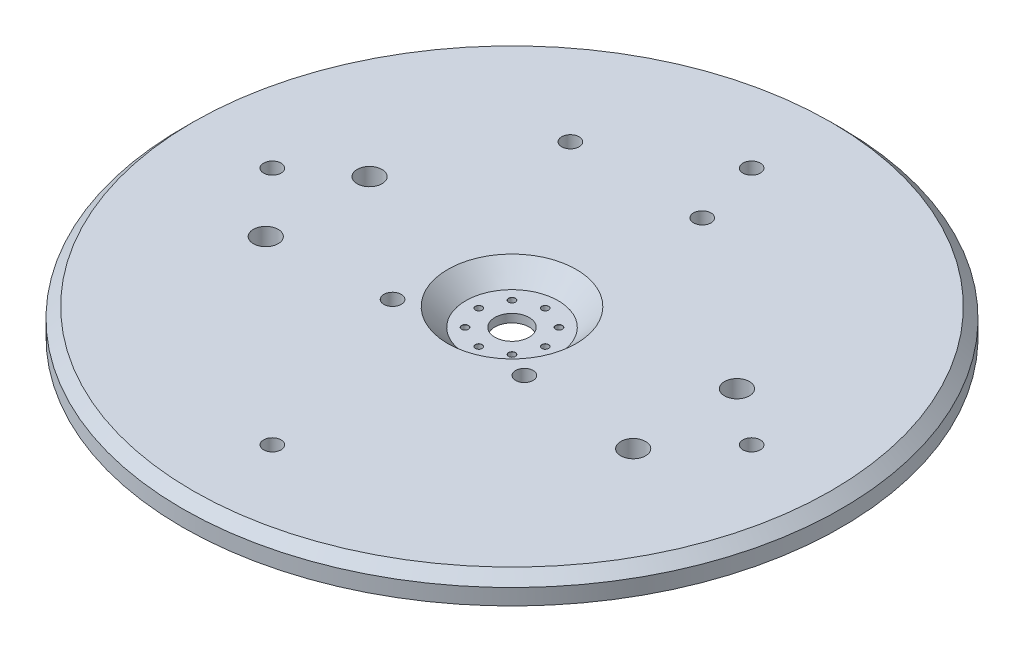
ISO-10303-21;
HEADER;
FILE_DESCRIPTION(('STEP AP214'),'2;1');
FILE_NAME('part.step','',(''),(''),'','','');
FILE_SCHEMA(('AUTOMOTIVE_DESIGN { 1 0 10303 214 1 1 1 1 }'));
ENDSEC;
DATA;
#1=APPLICATION_CONTEXT('core data for automotive mechanical design processes');
#2=APPLICATION_PROTOCOL_DEFINITION('international standard','automotive_design',2000,#1);
#3=PRODUCT_CONTEXT('',#1,'mechanical');
#4=PRODUCT('Part','Part','',(#3));
#5=PRODUCT_RELATED_PRODUCT_CATEGORY('part','',(#4));
#6=PRODUCT_DEFINITION_FORMATION('','',#4);
#7=PRODUCT_DEFINITION_CONTEXT('part definition',#1,'design');
#8=PRODUCT_DEFINITION('design','',#6,#7);
#9=PRODUCT_DEFINITION_SHAPE('','',#8);
#10=(LENGTH_UNIT() NAMED_UNIT(*) SI_UNIT(.MILLI.,.METRE.));
#11=(NAMED_UNIT(*) PLANE_ANGLE_UNIT() SI_UNIT($,.RADIAN.));
#12=(NAMED_UNIT(*) SI_UNIT($,.STERADIAN.) SOLID_ANGLE_UNIT());
#13=UNCERTAINTY_MEASURE_WITH_UNIT(LENGTH_MEASURE(1.E-05),#10,'distance_accuracy_value','');
#14=(GEOMETRIC_REPRESENTATION_CONTEXT(3) GLOBAL_UNCERTAINTY_ASSIGNED_CONTEXT((#13)) GLOBAL_UNIT_ASSIGNED_CONTEXT((#10,
#11,#12)) REPRESENTATION_CONTEXT('',''));
#15=CARTESIAN_POINT('',(0.,0.,0.));
#16=DIRECTION('',(0.,0.,1.));
#17=DIRECTION('',(1.,0.,0.));
#18=AXIS2_PLACEMENT_3D('',#15,#16,#17);
#19=CARTESIAN_POINT('',(0.,-3.175,0.));
#20=DIRECTION('',(0.,1.,0.));
#21=DIRECTION('',(0.,0.,1.));
#22=AXIS2_PLACEMENT_3D('',#19,#20,#21);
#23=CYLINDRICAL_SURFACE('',#22,4.127000001);
#24=CARTESIAN_POINT('',(0.,-3.175,0.));
#25=DIRECTION('',(0.,1.,0.));
#26=DIRECTION('',(0.,0.,1.));
#27=AXIS2_PLACEMENT_3D('',#24,#25,#26);
#28=CIRCLE('',#27,4.127000001);
#29=CARTESIAN_POINT('',(0.,-3.175,4.127000001));
#30=VERTEX_POINT('',#29);
#31=EDGE_CURVE('E115',#30,#30,#28,.T.);
#32=ORIENTED_EDGE('',*,*,#31,.F.);
#33=EDGE_LOOP('',(#32));
#34=FACE_BOUND('',#33,.T.);
#35=CARTESIAN_POINT('',(0.,-1.175,0.));
#36=DIRECTION('',(0.,1.,0.));
#37=DIRECTION('',(0.,0.,1.));
#38=AXIS2_PLACEMENT_3D('',#35,#36,#37);
#39=CIRCLE('',#38,4.127000001);
#40=CARTESIAN_POINT('',(0.,-1.175,4.127000001));
#41=VERTEX_POINT('',#40);
#42=EDGE_CURVE('E118',#41,#41,#39,.F.);
#43=ORIENTED_EDGE('',*,*,#42,.F.);
#44=EDGE_LOOP('',(#43));
#45=FACE_BOUND('',#44,.T.);
#46=ADVANCED_FACE('F46',(#34,#45),#23,.F.);
#47=CARTESIAN_POINT('',(0.,3.175,0.));
#48=DIRECTION('',(0.,-1.,0.));
#49=DIRECTION('',(0.,0.,-1.));
#50=AXIS2_PLACEMENT_3D('',#47,#48,#49);
#51=CYLINDRICAL_SURFACE('',#50,79.375);
#52=CARTESIAN_POINT('',(0.,0.674999999999942,0.));
#53=DIRECTION('',(0.,1.,0.));
#54=DIRECTION('',(0.,0.,1.));
#55=AXIS2_PLACEMENT_3D('',#52,#53,#54);
#56=CIRCLE('',#55,79.375);
#57=CARTESIAN_POINT('',(0.,0.674999999999942,79.375));
#58=VERTEX_POINT('',#57);
#59=EDGE_CURVE('E11',#58,#58,#56,.F.);
#60=ORIENTED_EDGE('',*,*,#59,.T.);
#61=EDGE_LOOP('',(#60));
#62=FACE_BOUND('',#61,.T.);
#63=CARTESIAN_POINT('',(0.,-3.175,0.));
#64=DIRECTION('',(0.,1.,0.));
#65=DIRECTION('',(0.,0.,1.));
#66=AXIS2_PLACEMENT_3D('',#63,#64,#65);
#67=CIRCLE('',#66,79.375);
#68=CARTESIAN_POINT('',(0.,-3.175,79.375));
#69=VERTEX_POINT('',#68);
#70=EDGE_CURVE('E62',#69,#69,#67,.T.);
#71=ORIENTED_EDGE('',*,*,#70,.T.);
#72=EDGE_LOOP('',(#71));
#73=FACE_BOUND('',#72,.T.);
#74=ADVANCED_FACE('F227',(#62,#73),#51,.T.);
#75=CARTESIAN_POINT('',(0.,3.175,0.));
#76=DIRECTION('',(0.,1.,0.));
#77=DIRECTION('',(0.,0.,1.));
#78=AXIS2_PLACEMENT_3D('',#75,#76,#77);
#79=PLANE('',#78);
#80=CARTESIAN_POINT('',(-57.7233851013783,3.175,0.));
#81=DIRECTION('',(0.,1.,0.));
#82=DIRECTION('',(0.,0.,1.));
#83=AXIS2_PLACEMENT_3D('',#80,#81,#82);
#84=CIRCLE('',#83,2.1);
#85=CARTESIAN_POINT('',(-57.7233851013783,3.175,2.09999999999998));
#86=VERTEX_POINT('',#85);
#87=EDGE_CURVE('E217',#86,#86,#84,.T.);
#88=ORIENTED_EDGE('',*,*,#87,.F.);
#89=EDGE_LOOP('',(#88));
#90=FACE_BOUND('',#89,.T.);
#91=CARTESIAN_POINT('',(0.,3.175,-57.7233851013783));
#92=DIRECTION('',(0.,1.,0.));
#93=DIRECTION('',(0.,0.,1.));
#94=AXIS2_PLACEMENT_3D('',#91,#92,#93);
#95=CIRCLE('',#94,2.1);
#96=CARTESIAN_POINT('',(0.,3.175,-55.6233851013783));
#97=VERTEX_POINT('',#96);
#98=EDGE_CURVE('E211',#97,#97,#95,.T.);
#99=ORIENTED_EDGE('',*,*,#98,.F.);
#100=EDGE_LOOP('',(#99));
#101=FACE_BOUND('',#100,.T.);
#102=CARTESIAN_POINT('',(57.7233851013783,3.175,0.));
#103=DIRECTION('',(0.,1.,0.));
#104=DIRECTION('',(0.,0.,1.));
#105=AXIS2_PLACEMENT_3D('',#102,#103,#104);
#106=CIRCLE('',#105,2.1);
#107=CARTESIAN_POINT('',(57.7233851013783,3.175,2.09999999999998));
#108=VERTEX_POINT('',#107);
#109=EDGE_CURVE('E205',#108,#108,#106,.T.);
#110=ORIENTED_EDGE('',*,*,#109,.F.);
#111=EDGE_LOOP('',(#110));
#112=FACE_BOUND('',#111,.T.);
#113=CARTESIAN_POINT('',(0.,3.175,57.7233851013783));
#114=DIRECTION('',(0.,1.,0.));
#115=DIRECTION('',(0.,0.,1.));
#116=AXIS2_PLACEMENT_3D('',#113,#114,#115);
#117=CIRCLE('',#116,2.1);
#118=CARTESIAN_POINT('',(0.,3.175,59.8233851013783));
#119=VERTEX_POINT('',#118);
#120=EDGE_CURVE('E199',#119,#119,#117,.T.);
#121=ORIENTED_EDGE('',*,*,#120,.F.);
#122=EDGE_LOOP('',(#121));
#123=FACE_BOUND('',#122,.T.);
#124=CARTESIAN_POINT('',(0.,3.175,0.));
#125=DIRECTION('',(0.,1.,0.));
#126=DIRECTION('',(0.,0.,1.));
#127=AXIS2_PLACEMENT_3D('',#124,#125,#126);
#128=CIRCLE('',#127,76.8749999999999);
#129=CARTESIAN_POINT('',(0.,3.175,76.8749999999999));
#130=VERTEX_POINT('',#129);
#131=EDGE_CURVE('E54',#130,#130,#128,.T.);
#132=ORIENTED_EDGE('',*,*,#131,.T.);
#133=EDGE_LOOP('',(#132));
#134=FACE_BOUND('',#133,.T.);
#135=CARTESIAN_POINT('',(0.,3.175,0.));
#136=DIRECTION('',(0.,1.,0.));
#137=DIRECTION('',(0.,0.,1.));
#138=AXIS2_PLACEMENT_3D('',#135,#136,#137);
#139=CIRCLE('',#138,15.476999971);
#140=CARTESIAN_POINT('',(0.,3.175,15.476999971));
#141=VERTEX_POINT('',#140);
#142=EDGE_CURVE('E58',#141,#141,#139,.F.);
#143=ORIENTED_EDGE('',*,*,#142,.T.);
#144=EDGE_LOOP('',(#143));
#145=FACE_BOUND('',#144,.T.);
#146=CARTESIAN_POINT('',(-44.245,3.175,-9.94158367188883));
#147=DIRECTION('',(0.,1.,0.));
#148=DIRECTION('',(0.,0.,1.));
#149=AXIS2_PLACEMENT_3D('',#146,#147,#148);
#150=CIRCLE('',#149,3.);
#151=CARTESIAN_POINT('',(-44.245,3.175,-6.94158367188882));
#152=VERTEX_POINT('',#151);
#153=EDGE_CURVE('E112',#152,#152,#150,.T.);
#154=ORIENTED_EDGE('',*,*,#153,.F.);
#155=EDGE_LOOP('',(#154));
#156=FACE_BOUND('',#155,.T.);
#157=CARTESIAN_POINT('',(-44.245,3.175,15.0584163281112));
#158=DIRECTION('',(0.,1.,0.));
#159=DIRECTION('',(0.,0.,1.));
#160=AXIS2_PLACEMENT_3D('',#157,#158,#159);
#161=CIRCLE('',#160,3.);
#162=CARTESIAN_POINT('',(-44.245,3.175,18.0584163281112));
#163=VERTEX_POINT('',#162);
#164=EDGE_CURVE('E106',#163,#163,#161,.T.);
#165=ORIENTED_EDGE('',*,*,#164,.F.);
#166=EDGE_LOOP('',(#165));
#167=FACE_BOUND('',#166,.T.);
#168=CARTESIAN_POINT('',(44.245,3.175,-9.94158367188884));
#169=DIRECTION('',(0.,1.,0.));
#170=DIRECTION('',(0.,0.,1.));
#171=AXIS2_PLACEMENT_3D('',#168,#169,#170);
#172=CIRCLE('',#171,3.);
#173=CARTESIAN_POINT('',(44.245,3.175,-6.94158367188883));
#174=VERTEX_POINT('',#173);
#175=EDGE_CURVE('E100',#174,#174,#172,.T.);
#176=ORIENTED_EDGE('',*,*,#175,.F.);
#177=EDGE_LOOP('',(#176));
#178=FACE_BOUND('',#177,.T.);
#179=CARTESIAN_POINT('',(44.245,3.175,15.0584163281112));
#180=DIRECTION('',(0.,1.,0.));
#181=DIRECTION('',(0.,0.,1.));
#182=AXIS2_PLACEMENT_3D('',#179,#180,#181);
#183=CIRCLE('',#182,3.);
#184=CARTESIAN_POINT('',(44.245,3.175,18.0584163281112));
#185=VERTEX_POINT('',#184);
#186=EDGE_CURVE('E94',#185,#185,#183,.T.);
#187=ORIENTED_EDGE('',*,*,#186,.F.);
#188=EDGE_LOOP('',(#187));
#189=FACE_BOUND('',#188,.T.);
#190=CARTESIAN_POINT('',(-27.3188086,3.175,-41.38978387));
#191=DIRECTION('',(0.,1.,0.));
#192=DIRECTION('',(0.,0.,1.));
#193=AXIS2_PLACEMENT_3D('',#190,#191,#192);
#194=CIRCLE('',#193,2.1);
#195=CARTESIAN_POINT('',(-27.3188086,3.175,-39.28978387));
#196=VERTEX_POINT('',#195);
#197=EDGE_CURVE('E88',#196,#196,#194,.T.);
#198=ORIENTED_EDGE('',*,*,#197,.F.);
#199=EDGE_LOOP('',(#198));
#200=FACE_BOUND('',#199,.T.);
#201=CARTESIAN_POINT('',(4.43119139999999,3.175,-41.38978387));
#202=DIRECTION('',(0.,1.,0.));
#203=DIRECTION('',(0.,0.,1.));
#204=AXIS2_PLACEMENT_3D('',#201,#202,#203);
#205=CIRCLE('',#204,2.1);
#206=CARTESIAN_POINT('',(4.43119139999999,3.175,-39.28978387));
#207=VERTEX_POINT('',#206);
#208=EDGE_CURVE('E82',#207,#207,#205,.T.);
#209=ORIENTED_EDGE('',*,*,#208,.F.);
#210=EDGE_LOOP('',(#209));
#211=FACE_BOUND('',#210,.T.);
#212=CARTESIAN_POINT('',(-15.875,3.175,12.895910708));
#213=DIRECTION('',(0.,1.,0.));
#214=DIRECTION('',(0.,0.,1.));
#215=AXIS2_PLACEMENT_3D('',#212,#213,#214);
#216=CIRCLE('',#215,2.1);
#217=CARTESIAN_POINT('',(-15.875,3.175,14.995910708));
#218=VERTEX_POINT('',#217);
#219=EDGE_CURVE('E76',#218,#218,#216,.T.);
#220=ORIENTED_EDGE('',*,*,#219,.F.);
#221=EDGE_LOOP('',(#220));
#222=FACE_BOUND('',#221,.T.);
#223=CARTESIAN_POINT('',(15.875,3.175,12.895910708));
#224=DIRECTION('',(0.,1.,0.));
#225=DIRECTION('',(0.,0.,1.));
#226=AXIS2_PLACEMENT_3D('',#223,#224,#225);
#227=CIRCLE('',#226,2.1);
#228=CARTESIAN_POINT('',(15.875,3.175,14.995910708));
#229=VERTEX_POINT('',#228);
#230=EDGE_CURVE('E70',#229,#229,#227,.T.);
#231=ORIENTED_EDGE('',*,*,#230,.F.);
#232=EDGE_LOOP('',(#231));
#233=FACE_BOUND('',#232,.T.);
#234=ADVANCED_FACE('F223',(#90,#101,#112,#123,#134,#145,#156,#167,#178,#189,#200,#211,#222,
#233),#79,.T.);
#235=CARTESIAN_POINT('',(0.,-3.175,0.));
#236=DIRECTION('',(0.,1.,0.));
#237=DIRECTION('',(0.,0.,1.));
#238=AXIS2_PLACEMENT_3D('',#235,#236,#237);
#239=PLANE('',#238);
#240=CARTESIAN_POINT('',(-57.7233851013783,-3.175,0.));
#241=DIRECTION('',(0.,1.,0.));
#242=DIRECTION('',(0.,0.,1.));
#243=AXIS2_PLACEMENT_3D('',#240,#241,#242);
#244=CIRCLE('',#243,2.1);
#245=CARTESIAN_POINT('',(-57.7233851013783,-3.175,2.09999999999998));
#246=VERTEX_POINT('',#245);
#247=EDGE_CURVE('E214',#246,#246,#244,.T.);
#248=ORIENTED_EDGE('',*,*,#247,.T.);
#249=EDGE_LOOP('',(#248));
#250=FACE_BOUND('',#249,.T.);
#251=CARTESIAN_POINT('',(0.,-3.175,-57.7233851013783));
#252=DIRECTION('',(0.,1.,0.));
#253=DIRECTION('',(0.,0.,1.));
#254=AXIS2_PLACEMENT_3D('',#251,#252,#253);
#255=CIRCLE('',#254,2.1);
#256=CARTESIAN_POINT('',(0.,-3.175,-55.6233851013783));
#257=VERTEX_POINT('',#256);
#258=EDGE_CURVE('E208',#257,#257,#255,.T.);
#259=ORIENTED_EDGE('',*,*,#258,.T.);
#260=EDGE_LOOP('',(#259));
#261=FACE_BOUND('',#260,.T.);
#262=CARTESIAN_POINT('',(57.7233851013783,-3.175,0.));
#263=DIRECTION('',(0.,1.,0.));
#264=DIRECTION('',(0.,0.,1.));
#265=AXIS2_PLACEMENT_3D('',#262,#263,#264);
#266=CIRCLE('',#265,2.1);
#267=CARTESIAN_POINT('',(57.7233851013783,-3.175,2.09999999999998));
#268=VERTEX_POINT('',#267);
#269=EDGE_CURVE('E202',#268,#268,#266,.T.);
#270=ORIENTED_EDGE('',*,*,#269,.T.);
#271=EDGE_LOOP('',(#270));
#272=FACE_BOUND('',#271,.T.);
#273=CARTESIAN_POINT('',(0.,-3.175,57.7233851013783));
#274=DIRECTION('',(0.,1.,0.));
#275=DIRECTION('',(0.,0.,1.));
#276=AXIS2_PLACEMENT_3D('',#273,#274,#275);
#277=CIRCLE('',#276,2.1);
#278=CARTESIAN_POINT('',(0.,-3.175,59.8233851013783));
#279=VERTEX_POINT('',#278);
#280=EDGE_CURVE('E196',#279,#279,#277,.T.);
#281=ORIENTED_EDGE('',*,*,#280,.T.);
#282=EDGE_LOOP('',(#281));
#283=FACE_BOUND('',#282,.T.);
#284=CARTESIAN_POINT('',(-8.,-3.175,0.));
#285=DIRECTION('',(0.,1.,0.));
#286=DIRECTION('',(0.,0.,1.));
#287=AXIS2_PLACEMENT_3D('',#284,#285,#286);
#288=CIRCLE('',#287,0.799999999999997);
#289=CARTESIAN_POINT('',(-8.,-3.175,0.799999999999999));
#290=VERTEX_POINT('',#289);
#291=EDGE_CURVE('E187',#290,#290,#288,.T.);
#292=ORIENTED_EDGE('',*,*,#291,.T.);
#293=EDGE_LOOP('',(#292));
#294=FACE_BOUND('',#293,.T.);
#295=CARTESIAN_POINT('',(-5.65685424949238,-3.175,-5.65685424949238));
#296=DIRECTION('',(0.,1.,0.));
#297=DIRECTION('',(0.,0.,1.));
#298=AXIS2_PLACEMENT_3D('',#295,#296,#297);
#299=CIRCLE('',#298,0.799999999999997);
#300=CARTESIAN_POINT('',(-5.65685424949238,-3.175,-4.85685424949238));
#301=VERTEX_POINT('',#300);
#302=EDGE_CURVE('E178',#301,#301,#299,.T.);
#303=ORIENTED_EDGE('',*,*,#302,.T.);
#304=EDGE_LOOP('',(#303));
#305=FACE_BOUND('',#304,.T.);
#306=CARTESIAN_POINT('',(0.,-3.175,-8.));
#307=DIRECTION('',(0.,1.,0.));
#308=DIRECTION('',(0.,0.,1.));
#309=AXIS2_PLACEMENT_3D('',#306,#307,#308);
#310=CIRCLE('',#309,0.799999999999997);
#311=CARTESIAN_POINT('',(0.,-3.175,-7.2));
#312=VERTEX_POINT('',#311);
#313=EDGE_CURVE('E169',#312,#312,#310,.T.);
#314=ORIENTED_EDGE('',*,*,#313,.T.);
#315=EDGE_LOOP('',(#314));
#316=FACE_BOUND('',#315,.T.);
#317=CARTESIAN_POINT('',(5.65685424949238,-3.175,-5.65685424949238));
#318=DIRECTION('',(0.,1.,0.));
#319=DIRECTION('',(0.,0.,1.));
#320=AXIS2_PLACEMENT_3D('',#317,#318,#319);
#321=CIRCLE('',#320,0.799999999999997);
#322=CARTESIAN_POINT('',(5.65685424949238,-3.175,-4.85685424949239));
#323=VERTEX_POINT('',#322);
#324=EDGE_CURVE('E160',#323,#323,#321,.T.);
#325=ORIENTED_EDGE('',*,*,#324,.T.);
#326=EDGE_LOOP('',(#325));
#327=FACE_BOUND('',#326,.T.);
#328=CARTESIAN_POINT('',(8.,-3.175,0.));
#329=DIRECTION('',(0.,1.,0.));
#330=DIRECTION('',(0.,0.,1.));
#331=AXIS2_PLACEMENT_3D('',#328,#329,#330);
#332=CIRCLE('',#331,0.799999999999997);
#333=CARTESIAN_POINT('',(8.,-3.175,0.799999999999997));
#334=VERTEX_POINT('',#333);
#335=EDGE_CURVE('E151',#334,#334,#332,.T.);
#336=ORIENTED_EDGE('',*,*,#335,.T.);
#337=EDGE_LOOP('',(#336));
#338=FACE_BOUND('',#337,.T.);
#339=CARTESIAN_POINT('',(5.65685424949238,-3.175,5.65685424949238));
#340=DIRECTION('',(0.,1.,0.));
#341=DIRECTION('',(0.,0.,1.));
#342=AXIS2_PLACEMENT_3D('',#339,#340,#341);
#343=CIRCLE('',#342,0.799999999999997);
#344=CARTESIAN_POINT('',(5.65685424949238,-3.175,6.45685424949238));
#345=VERTEX_POINT('',#344);
#346=EDGE_CURVE('E142',#345,#345,#343,.T.);
#347=ORIENTED_EDGE('',*,*,#346,.T.);
#348=EDGE_LOOP('',(#347));
#349=FACE_BOUND('',#348,.T.);
#350=CARTESIAN_POINT('',(0.,-3.175,8.));
#351=DIRECTION('',(0.,1.,0.));
#352=DIRECTION('',(0.,0.,1.));
#353=AXIS2_PLACEMENT_3D('',#350,#351,#352);
#354=CIRCLE('',#353,0.799999999999997);
#355=CARTESIAN_POINT('',(0.,-3.175,8.8));
#356=VERTEX_POINT('',#355);
#357=EDGE_CURVE('E133',#356,#356,#354,.T.);
#358=ORIENTED_EDGE('',*,*,#357,.T.);
#359=EDGE_LOOP('',(#358));
#360=FACE_BOUND('',#359,.T.);
#361=CARTESIAN_POINT('',(-5.65685424949238,-3.175,5.65685424949238));
#362=DIRECTION('',(0.,1.,0.));
#363=DIRECTION('',(0.,0.,1.));
#364=AXIS2_PLACEMENT_3D('',#361,#362,#363);
#365=CIRCLE('',#364,0.799999999999997);
#366=CARTESIAN_POINT('',(-5.65685424949238,-3.175,6.45685424949238));
#367=VERTEX_POINT('',#366);
#368=EDGE_CURVE('E124',#367,#367,#365,.T.);
#369=ORIENTED_EDGE('',*,*,#368,.T.);
#370=EDGE_LOOP('',(#369));
#371=FACE_BOUND('',#370,.T.);
#372=ORIENTED_EDGE('',*,*,#31,.T.);
#373=EDGE_LOOP('',(#372));
#374=FACE_BOUND('',#373,.T.);
#375=CARTESIAN_POINT('',(-44.245,-3.175,-9.94158367188883));
#376=DIRECTION('',(0.,1.,0.));
#377=DIRECTION('',(0.,0.,1.));
#378=AXIS2_PLACEMENT_3D('',#375,#376,#377);
#379=CIRCLE('',#378,3.);
#380=CARTESIAN_POINT('',(-44.245,-3.175,-6.94158367188883));
#381=VERTEX_POINT('',#380);
#382=EDGE_CURVE('E109',#381,#381,#379,.T.);
#383=ORIENTED_EDGE('',*,*,#382,.T.);
#384=EDGE_LOOP('',(#383));
#385=FACE_BOUND('',#384,.T.);
#386=CARTESIAN_POINT('',(-44.245,-3.175,15.0584163281112));
#387=DIRECTION('',(0.,1.,0.));
#388=DIRECTION('',(0.,0.,1.));
#389=AXIS2_PLACEMENT_3D('',#386,#387,#388);
#390=CIRCLE('',#389,3.);
#391=CARTESIAN_POINT('',(-44.245,-3.175,18.0584163281112));
#392=VERTEX_POINT('',#391);
#393=EDGE_CURVE('E103',#392,#392,#390,.T.);
#394=ORIENTED_EDGE('',*,*,#393,.T.);
#395=EDGE_LOOP('',(#394));
#396=FACE_BOUND('',#395,.T.);
#397=CARTESIAN_POINT('',(44.245,-3.175,-9.94158367188884));
#398=DIRECTION('',(0.,1.,0.));
#399=DIRECTION('',(0.,0.,1.));
#400=AXIS2_PLACEMENT_3D('',#397,#398,#399);
#401=CIRCLE('',#400,3.);
#402=CARTESIAN_POINT('',(44.245,-3.175,-6.94158367188884));
#403=VERTEX_POINT('',#402);
#404=EDGE_CURVE('E97',#403,#403,#401,.T.);
#405=ORIENTED_EDGE('',*,*,#404,.T.);
#406=EDGE_LOOP('',(#405));
#407=FACE_BOUND('',#406,.T.);
#408=CARTESIAN_POINT('',(44.245,-3.175,15.0584163281112));
#409=DIRECTION('',(0.,1.,0.));
#410=DIRECTION('',(0.,0.,1.));
#411=AXIS2_PLACEMENT_3D('',#408,#409,#410);
#412=CIRCLE('',#411,3.);
#413=CARTESIAN_POINT('',(44.245,-3.175,18.0584163281112));
#414=VERTEX_POINT('',#413);
#415=EDGE_CURVE('E91',#414,#414,#412,.T.);
#416=ORIENTED_EDGE('',*,*,#415,.T.);
#417=EDGE_LOOP('',(#416));
#418=FACE_BOUND('',#417,.T.);
#419=CARTESIAN_POINT('',(-27.3188086,-3.175,-41.38978387));
#420=DIRECTION('',(0.,1.,0.));
#421=DIRECTION('',(0.,0.,1.));
#422=AXIS2_PLACEMENT_3D('',#419,#420,#421);
#423=CIRCLE('',#422,2.1);
#424=CARTESIAN_POINT('',(-27.3188086,-3.175,-39.28978387));
#425=VERTEX_POINT('',#424);
#426=EDGE_CURVE('E85',#425,#425,#423,.T.);
#427=ORIENTED_EDGE('',*,*,#426,.T.);
#428=EDGE_LOOP('',(#427));
#429=FACE_BOUND('',#428,.T.);
#430=CARTESIAN_POINT('',(4.43119139999999,-3.175,-41.38978387));
#431=DIRECTION('',(0.,1.,0.));
#432=DIRECTION('',(0.,0.,1.));
#433=AXIS2_PLACEMENT_3D('',#430,#431,#432);
#434=CIRCLE('',#433,2.1);
#435=CARTESIAN_POINT('',(4.43119139999999,-3.175,-39.28978387));
#436=VERTEX_POINT('',#435);
#437=EDGE_CURVE('E79',#436,#436,#434,.T.);
#438=ORIENTED_EDGE('',*,*,#437,.T.);
#439=EDGE_LOOP('',(#438));
#440=FACE_BOUND('',#439,.T.);
#441=CARTESIAN_POINT('',(-15.875,-3.175,12.895910708));
#442=DIRECTION('',(0.,1.,0.));
#443=DIRECTION('',(0.,0.,1.));
#444=AXIS2_PLACEMENT_3D('',#441,#442,#443);
#445=CIRCLE('',#444,2.1);
#446=CARTESIAN_POINT('',(-15.875,-3.175,14.995910708));
#447=VERTEX_POINT('',#446);
#448=EDGE_CURVE('E73',#447,#447,#445,.T.);
#449=ORIENTED_EDGE('',*,*,#448,.T.);
#450=EDGE_LOOP('',(#449));
#451=FACE_BOUND('',#450,.T.);
#452=CARTESIAN_POINT('',(15.875,-3.175,12.895910708));
#453=DIRECTION('',(0.,1.,0.));
#454=DIRECTION('',(0.,0.,1.));
#455=AXIS2_PLACEMENT_3D('',#452,#453,#454);
#456=CIRCLE('',#455,2.1);
#457=CARTESIAN_POINT('',(15.875,-3.175,14.995910708));
#458=VERTEX_POINT('',#457);
#459=EDGE_CURVE('E67',#458,#458,#456,.T.);
#460=ORIENTED_EDGE('',*,*,#459,.T.);
#461=EDGE_LOOP('',(#460));
#462=FACE_BOUND('',#461,.T.);
#463=ORIENTED_EDGE('',*,*,#70,.F.);
#464=EDGE_LOOP('',(#463));
#465=FACE_BOUND('',#464,.T.);
#466=ADVANCED_FACE('F226',(#250,#261,#272,#283,#294,#305,#316,#327,#338,#349,#360,#371,#374,
#385,#396,#407,#418,#429,#440,#451,#462,#465),#239,.F.);
#467=CARTESIAN_POINT('',(15.875,3.175,12.895910708));
#468=DIRECTION('',(0.,1.,0.));
#469=DIRECTION('',(0.,0.,1.));
#470=AXIS2_PLACEMENT_3D('',#467,#468,#469);
#471=CYLINDRICAL_SURFACE('',#470,2.1);
#472=ORIENTED_EDGE('',*,*,#459,.F.);
#473=EDGE_LOOP('',(#472));
#474=FACE_BOUND('',#473,.T.);
#475=ORIENTED_EDGE('',*,*,#230,.T.);
#476=EDGE_LOOP('',(#475));
#477=FACE_BOUND('',#476,.T.);
#478=ADVANCED_FACE('F253',(#474,#477),#471,.F.);
#479=CARTESIAN_POINT('',(-15.875,3.175,12.895910708));
#480=DIRECTION('',(0.,1.,0.));
#481=DIRECTION('',(0.,0.,1.));
#482=AXIS2_PLACEMENT_3D('',#479,#480,#481);
#483=CYLINDRICAL_SURFACE('',#482,2.1);
#484=ORIENTED_EDGE('',*,*,#448,.F.);
#485=EDGE_LOOP('',(#484));
#486=FACE_BOUND('',#485,.T.);
#487=ORIENTED_EDGE('',*,*,#219,.T.);
#488=EDGE_LOOP('',(#487));
#489=FACE_BOUND('',#488,.T.);
#490=ADVANCED_FACE('F255',(#486,#489),#483,.F.);
#491=CARTESIAN_POINT('',(4.43119139999999,3.175,-41.38978387));
#492=DIRECTION('',(0.,1.,0.));
#493=DIRECTION('',(0.,0.,1.));
#494=AXIS2_PLACEMENT_3D('',#491,#492,#493);
#495=CYLINDRICAL_SURFACE('',#494,2.1);
#496=ORIENTED_EDGE('',*,*,#437,.F.);
#497=EDGE_LOOP('',(#496));
#498=FACE_BOUND('',#497,.T.);
#499=ORIENTED_EDGE('',*,*,#208,.T.);
#500=EDGE_LOOP('',(#499));
#501=FACE_BOUND('',#500,.T.);
#502=ADVANCED_FACE('F262',(#498,#501),#495,.F.);
#503=CARTESIAN_POINT('',(-27.3188086,3.175,-41.38978387));
#504=DIRECTION('',(0.,1.,0.));
#505=DIRECTION('',(0.,0.,1.));
#506=AXIS2_PLACEMENT_3D('',#503,#504,#505);
#507=CYLINDRICAL_SURFACE('',#506,2.1);
#508=ORIENTED_EDGE('',*,*,#426,.F.);
#509=EDGE_LOOP('',(#508));
#510=FACE_BOUND('',#509,.T.);
#511=ORIENTED_EDGE('',*,*,#197,.T.);
#512=EDGE_LOOP('',(#511));
#513=FACE_BOUND('',#512,.T.);
#514=ADVANCED_FACE('F297',(#510,#513),#507,.F.);
#515=CARTESIAN_POINT('',(44.245,3.175,15.0584163281112));
#516=DIRECTION('',(0.,1.,0.));
#517=DIRECTION('',(0.,0.,1.));
#518=AXIS2_PLACEMENT_3D('',#515,#516,#517);
#519=CYLINDRICAL_SURFACE('',#518,3.);
#520=ORIENTED_EDGE('',*,*,#415,.F.);
#521=EDGE_LOOP('',(#520));
#522=FACE_BOUND('',#521,.T.);
#523=ORIENTED_EDGE('',*,*,#186,.T.);
#524=EDGE_LOOP('',(#523));
#525=FACE_BOUND('',#524,.T.);
#526=ADVANCED_FACE('F293',(#522,#525),#519,.F.);
#527=CARTESIAN_POINT('',(44.245,3.175,-9.94158367188884));
#528=DIRECTION('',(0.,1.,0.));
#529=DIRECTION('',(0.,0.,1.));
#530=AXIS2_PLACEMENT_3D('',#527,#528,#529);
#531=CYLINDRICAL_SURFACE('',#530,3.);
#532=ORIENTED_EDGE('',*,*,#404,.F.);
#533=EDGE_LOOP('',(#532));
#534=FACE_BOUND('',#533,.T.);
#535=ORIENTED_EDGE('',*,*,#175,.T.);
#536=EDGE_LOOP('',(#535));
#537=FACE_BOUND('',#536,.T.);
#538=ADVANCED_FACE('F289',(#534,#537),#531,.F.);
#539=CARTESIAN_POINT('',(-44.245,3.175,15.0584163281112));
#540=DIRECTION('',(0.,1.,0.));
#541=DIRECTION('',(0.,0.,1.));
#542=AXIS2_PLACEMENT_3D('',#539,#540,#541);
#543=CYLINDRICAL_SURFACE('',#542,3.);
#544=ORIENTED_EDGE('',*,*,#393,.F.);
#545=EDGE_LOOP('',(#544));
#546=FACE_BOUND('',#545,.T.);
#547=ORIENTED_EDGE('',*,*,#164,.T.);
#548=EDGE_LOOP('',(#547));
#549=FACE_BOUND('',#548,.T.);
#550=ADVANCED_FACE('F285',(#546,#549),#543,.F.);
#551=CARTESIAN_POINT('',(-44.245,3.175,-9.94158367188883));
#552=DIRECTION('',(0.,1.,0.));
#553=DIRECTION('',(0.,0.,1.));
#554=AXIS2_PLACEMENT_3D('',#551,#552,#553);
#555=CYLINDRICAL_SURFACE('',#554,3.);
#556=ORIENTED_EDGE('',*,*,#382,.F.);
#557=EDGE_LOOP('',(#556));
#558=FACE_BOUND('',#557,.T.);
#559=ORIENTED_EDGE('',*,*,#153,.T.);
#560=EDGE_LOOP('',(#559));
#561=FACE_BOUND('',#560,.T.);
#562=ADVANCED_FACE('F282',(#558,#561),#555,.F.);
#563=CARTESIAN_POINT('',(0.,-1.175,0.));
#564=DIRECTION('',(0.,1.,0.));
#565=DIRECTION('',(0.,0.,1.));
#566=AXIS2_PLACEMENT_3D('',#563,#564,#565);
#567=PLANE('',#566);
#568=CARTESIAN_POINT('',(-8.,-1.175,0.));
#569=DIRECTION('',(0.,1.,0.));
#570=DIRECTION('',(0.,0.,1.));
#571=AXIS2_PLACEMENT_3D('',#568,#569,#570);
#572=CIRCLE('',#571,0.824999999999999);
#573=CARTESIAN_POINT('',(-8.,-1.175,0.825000000000001));
#574=VERTEX_POINT('',#573);
#575=EDGE_CURVE('E193',#574,#574,#572,.T.);
#576=ORIENTED_EDGE('',*,*,#575,.F.);
#577=EDGE_LOOP('',(#576));
#578=FACE_BOUND('',#577,.T.);
#579=CARTESIAN_POINT('',(-5.65685424949238,-1.175,-5.65685424949238));
#580=DIRECTION('',(0.,1.,0.));
#581=DIRECTION('',(0.,0.,1.));
#582=AXIS2_PLACEMENT_3D('',#579,#580,#581);
#583=CIRCLE('',#582,0.824999999999999);
#584=CARTESIAN_POINT('',(-5.65685424949238,-1.175,-4.83185424949238));
#585=VERTEX_POINT('',#584);
#586=EDGE_CURVE('E184',#585,#585,#583,.T.);
#587=ORIENTED_EDGE('',*,*,#586,.F.);
#588=EDGE_LOOP('',(#587));
#589=FACE_BOUND('',#588,.T.);
#590=CARTESIAN_POINT('',(0.,-1.175,-8.));
#591=DIRECTION('',(0.,1.,0.));
#592=DIRECTION('',(0.,0.,1.));
#593=AXIS2_PLACEMENT_3D('',#590,#591,#592);
#594=CIRCLE('',#593,0.824999999999999);
#595=CARTESIAN_POINT('',(0.,-1.175,-7.175));
#596=VERTEX_POINT('',#595);
#597=EDGE_CURVE('E175',#596,#596,#594,.T.);
#598=ORIENTED_EDGE('',*,*,#597,.F.);
#599=EDGE_LOOP('',(#598));
#600=FACE_BOUND('',#599,.T.);
#601=CARTESIAN_POINT('',(5.65685424949238,-1.175,-5.65685424949238));
#602=DIRECTION('',(0.,1.,0.));
#603=DIRECTION('',(0.,0.,1.));
#604=AXIS2_PLACEMENT_3D('',#601,#602,#603);
#605=CIRCLE('',#604,0.824999999999999);
#606=CARTESIAN_POINT('',(5.65685424949238,-1.175,-4.83185424949238));
#607=VERTEX_POINT('',#606);
#608=EDGE_CURVE('E166',#607,#607,#605,.T.);
#609=ORIENTED_EDGE('',*,*,#608,.F.);
#610=EDGE_LOOP('',(#609));
#611=FACE_BOUND('',#610,.T.);
#612=CARTESIAN_POINT('',(8.,-1.175,0.));
#613=DIRECTION('',(0.,1.,0.));
#614=DIRECTION('',(0.,0.,1.));
#615=AXIS2_PLACEMENT_3D('',#612,#613,#614);
#616=CIRCLE('',#615,0.824999999999999);
#617=CARTESIAN_POINT('',(8.,-1.175,0.824999999999999));
#618=VERTEX_POINT('',#617);
#619=EDGE_CURVE('E157',#618,#618,#616,.T.);
#620=ORIENTED_EDGE('',*,*,#619,.F.);
#621=EDGE_LOOP('',(#620));
#622=FACE_BOUND('',#621,.T.);
#623=CARTESIAN_POINT('',(5.65685424949238,-1.175,5.65685424949238));
#624=DIRECTION('',(0.,1.,0.));
#625=DIRECTION('',(0.,0.,1.));
#626=AXIS2_PLACEMENT_3D('',#623,#624,#625);
#627=CIRCLE('',#626,0.824999999999999);
#628=CARTESIAN_POINT('',(5.65685424949238,-1.175,6.48185424949238));
#629=VERTEX_POINT('',#628);
#630=EDGE_CURVE('E148',#629,#629,#627,.T.);
#631=ORIENTED_EDGE('',*,*,#630,.F.);
#632=EDGE_LOOP('',(#631));
#633=FACE_BOUND('',#632,.T.);
#634=CARTESIAN_POINT('',(0.,-1.175,8.));
#635=DIRECTION('',(0.,1.,0.));
#636=DIRECTION('',(0.,0.,1.));
#637=AXIS2_PLACEMENT_3D('',#634,#635,#636);
#638=CIRCLE('',#637,0.824999999999999);
#639=CARTESIAN_POINT('',(0.,-1.175,8.825));
#640=VERTEX_POINT('',#639);
#641=EDGE_CURVE('E139',#640,#640,#638,.T.);
#642=ORIENTED_EDGE('',*,*,#641,.F.);
#643=EDGE_LOOP('',(#642));
#644=FACE_BOUND('',#643,.T.);
#645=CARTESIAN_POINT('',(-5.65685424949238,-1.175,5.65685424949238));
#646=DIRECTION('',(0.,1.,0.));
#647=DIRECTION('',(0.,0.,1.));
#648=AXIS2_PLACEMENT_3D('',#645,#646,#647);
#649=CIRCLE('',#648,0.824999999999999);
#650=CARTESIAN_POINT('',(-5.65685424949238,-1.175,6.48185424949238));
#651=VERTEX_POINT('',#650);
#652=EDGE_CURVE('E130',#651,#651,#649,.T.);
#653=ORIENTED_EDGE('',*,*,#652,.F.);
#654=EDGE_LOOP('',(#653));
#655=FACE_BOUND('',#654,.T.);
#656=CARTESIAN_POINT('',(0.,-1.175,0.));
#657=DIRECTION('',(0.,1.,0.));
#658=DIRECTION('',(0.,0.,1.));
#659=AXIS2_PLACEMENT_3D('',#656,#657,#658);
#660=CIRCLE('',#659,11.126999971);
#661=CARTESIAN_POINT('',(0.,-1.175,11.126999971));
#662=VERTEX_POINT('',#661);
#663=EDGE_CURVE('E121',#662,#662,#660,.F.);
#664=ORIENTED_EDGE('',*,*,#663,.F.);
#665=EDGE_LOOP('',(#664));
#666=FACE_BOUND('',#665,.T.);
#667=ORIENTED_EDGE('',*,*,#42,.T.);
#668=EDGE_LOOP('',(#667));
#669=FACE_BOUND('',#668,.T.);
#670=ADVANCED_FACE('F280',(#578,#589,#600,#611,#622,#633,#644,#655,#666,#669),#567,.T.);
#671=CARTESIAN_POINT('',(0.,-1.17499999999997,0.));
#672=DIRECTION('',(0.,1.,0.));
#673=DIRECTION('',(0.,0.,1.));
#674=AXIS2_PLACEMENT_3D('',#671,#672,#673);
#675=CONICAL_SURFACE('',#674,11.126999971,0.785398163397448);
#676=ORIENTED_EDGE('',*,*,#142,.F.);
#677=EDGE_LOOP('',(#676));
#678=FACE_BOUND('',#677,.T.);
#679=ORIENTED_EDGE('',*,*,#663,.T.);
#680=EDGE_LOOP('',(#679));
#681=FACE_BOUND('',#680,.T.);
#682=ADVANCED_FACE('F344',(#678,#681),#675,.F.);
#683=CARTESIAN_POINT('',(-5.65685424949238,-1.175,5.65685424949238));
#684=DIRECTION('',(0.,1.,0.));
#685=DIRECTION('',(0.,0.,1.));
#686=AXIS2_PLACEMENT_3D('',#683,#684,#685);
#687=CYLINDRICAL_SURFACE('',#686,0.799999999999997);
#688=ORIENTED_EDGE('',*,*,#368,.F.);
#689=EDGE_LOOP('',(#688));
#690=FACE_BOUND('',#689,.T.);
#691=CARTESIAN_POINT('',(-5.65685424949238,-1.2,5.65685424949238));
#692=DIRECTION('',(0.,1.,0.));
#693=DIRECTION('',(0.,0.,1.));
#694=AXIS2_PLACEMENT_3D('',#691,#692,#693);
#695=CIRCLE('',#694,0.799999999999997);
#696=CARTESIAN_POINT('',(-5.65685424949238,-1.2,6.45685424949238));
#697=VERTEX_POINT('',#696);
#698=EDGE_CURVE('E127',#697,#697,#695,.T.);
#699=ORIENTED_EDGE('',*,*,#698,.T.);
#700=EDGE_LOOP('',(#699));
#701=FACE_BOUND('',#700,.T.);
#702=ADVANCED_FACE('F352',(#690,#701),#687,.F.);
#703=CARTESIAN_POINT('',(-5.65685424949238,-1.175,5.65685424949238));
#704=DIRECTION('',(0.,1.,0.));
#705=DIRECTION('',(0.,0.,1.));
#706=AXIS2_PLACEMENT_3D('',#703,#704,#705);
#707=CONICAL_SURFACE('',#706,0.824999999999999,0.785398163397518);
#708=ORIENTED_EDGE('',*,*,#698,.F.);
#709=EDGE_LOOP('',(#708));
#710=FACE_BOUND('',#709,.T.);
#711=ORIENTED_EDGE('',*,*,#652,.T.);
#712=EDGE_LOOP('',(#711));
#713=FACE_BOUND('',#712,.T.);
#714=ADVANCED_FACE('F358',(#710,#713),#707,.F.);
#715=CARTESIAN_POINT('',(0.,-1.175,8.));
#716=DIRECTION('',(0.,1.,0.));
#717=DIRECTION('',(0.,0.,1.));
#718=AXIS2_PLACEMENT_3D('',#715,#716,#717);
#719=CYLINDRICAL_SURFACE('',#718,0.799999999999997);
#720=ORIENTED_EDGE('',*,*,#357,.F.);
#721=EDGE_LOOP('',(#720));
#722=FACE_BOUND('',#721,.T.);
#723=CARTESIAN_POINT('',(0.,-1.2,8.));
#724=DIRECTION('',(0.,1.,0.));
#725=DIRECTION('',(0.,0.,1.));
#726=AXIS2_PLACEMENT_3D('',#723,#724,#725);
#727=CIRCLE('',#726,0.799999999999997);
#728=CARTESIAN_POINT('',(0.,-1.2,8.8));
#729=VERTEX_POINT('',#728);
#730=EDGE_CURVE('E136',#729,#729,#727,.T.);
#731=ORIENTED_EDGE('',*,*,#730,.T.);
#732=EDGE_LOOP('',(#731));
#733=FACE_BOUND('',#732,.T.);
#734=ADVANCED_FACE('F365',(#722,#733),#719,.F.);
#735=CARTESIAN_POINT('',(0.,-1.175,8.));
#736=DIRECTION('',(0.,1.,0.));
#737=DIRECTION('',(0.,0.,1.));
#738=AXIS2_PLACEMENT_3D('',#735,#736,#737);
#739=CONICAL_SURFACE('',#738,0.824999999999999,0.785398163397511);
#740=ORIENTED_EDGE('',*,*,#730,.F.);
#741=EDGE_LOOP('',(#740));
#742=FACE_BOUND('',#741,.T.);
#743=ORIENTED_EDGE('',*,*,#641,.T.);
#744=EDGE_LOOP('',(#743));
#745=FACE_BOUND('',#744,.T.);
#746=ADVANCED_FACE('F373',(#742,#745),#739,.F.);
#747=CARTESIAN_POINT('',(5.65685424949238,-1.175,5.65685424949238));
#748=DIRECTION('',(0.,1.,0.));
#749=DIRECTION('',(0.,0.,1.));
#750=AXIS2_PLACEMENT_3D('',#747,#748,#749);
#751=CYLINDRICAL_SURFACE('',#750,0.799999999999997);
#752=ORIENTED_EDGE('',*,*,#346,.F.);
#753=EDGE_LOOP('',(#752));
#754=FACE_BOUND('',#753,.T.);
#755=CARTESIAN_POINT('',(5.65685424949238,-1.2,5.65685424949238));
#756=DIRECTION('',(0.,1.,0.));
#757=DIRECTION('',(0.,0.,1.));
#758=AXIS2_PLACEMENT_3D('',#755,#756,#757);
#759=CIRCLE('',#758,0.799999999999997);
#760=CARTESIAN_POINT('',(5.65685424949238,-1.2,6.45685424949238));
#761=VERTEX_POINT('',#760);
#762=EDGE_CURVE('E145',#761,#761,#759,.T.);
#763=ORIENTED_EDGE('',*,*,#762,.T.);
#764=EDGE_LOOP('',(#763));
#765=FACE_BOUND('',#764,.T.);
#766=ADVANCED_FACE('F381',(#754,#765),#751,.F.);
#767=CARTESIAN_POINT('',(5.65685424949238,-1.175,5.65685424949238));
#768=DIRECTION('',(0.,1.,0.));
#769=DIRECTION('',(0.,0.,1.));
#770=AXIS2_PLACEMENT_3D('',#767,#768,#769);
#771=CONICAL_SURFACE('',#770,0.824999999999999,0.785398163397518);
#772=ORIENTED_EDGE('',*,*,#762,.F.);
#773=EDGE_LOOP('',(#772));
#774=FACE_BOUND('',#773,.T.);
#775=ORIENTED_EDGE('',*,*,#630,.T.);
#776=EDGE_LOOP('',(#775));
#777=FACE_BOUND('',#776,.T.);
#778=ADVANCED_FACE('F389',(#774,#777),#771,.F.);
#779=CARTESIAN_POINT('',(8.,-1.175,0.));
#780=DIRECTION('',(0.,1.,0.));
#781=DIRECTION('',(0.,0.,1.));
#782=AXIS2_PLACEMENT_3D('',#779,#780,#781);
#783=CYLINDRICAL_SURFACE('',#782,0.799999999999997);
#784=ORIENTED_EDGE('',*,*,#335,.F.);
#785=EDGE_LOOP('',(#784));
#786=FACE_BOUND('',#785,.T.);
#787=CARTESIAN_POINT('',(8.,-1.2,0.));
#788=DIRECTION('',(0.,1.,0.));
#789=DIRECTION('',(0.,0.,1.));
#790=AXIS2_PLACEMENT_3D('',#787,#788,#789);
#791=CIRCLE('',#790,0.799999999999997);
#792=CARTESIAN_POINT('',(8.,-1.2,0.799999999999997));
#793=VERTEX_POINT('',#792);
#794=EDGE_CURVE('E154',#793,#793,#791,.T.);
#795=ORIENTED_EDGE('',*,*,#794,.T.);
#796=EDGE_LOOP('',(#795));
#797=FACE_BOUND('',#796,.T.);
#798=ADVANCED_FACE('F397',(#786,#797),#783,.F.);
#799=CARTESIAN_POINT('',(8.,-1.175,0.));
#800=DIRECTION('',(0.,1.,0.));
#801=DIRECTION('',(0.,0.,1.));
#802=AXIS2_PLACEMENT_3D('',#799,#800,#801);
#803=CONICAL_SURFACE('',#802,0.824999999999999,0.785398163397518);
#804=ORIENTED_EDGE('',*,*,#794,.F.);
#805=EDGE_LOOP('',(#804));
#806=FACE_BOUND('',#805,.T.);
#807=ORIENTED_EDGE('',*,*,#619,.T.);
#808=EDGE_LOOP('',(#807));
#809=FACE_BOUND('',#808,.T.);
#810=ADVANCED_FACE('F405',(#806,#809),#803,.F.);
#811=CARTESIAN_POINT('',(5.65685424949238,-1.175,-5.65685424949238));
#812=DIRECTION('',(0.,1.,0.));
#813=DIRECTION('',(0.,0.,1.));
#814=AXIS2_PLACEMENT_3D('',#811,#812,#813);
#815=CYLINDRICAL_SURFACE('',#814,0.799999999999997);
#816=ORIENTED_EDGE('',*,*,#324,.F.);
#817=EDGE_LOOP('',(#816));
#818=FACE_BOUND('',#817,.T.);
#819=CARTESIAN_POINT('',(5.65685424949238,-1.2,-5.65685424949238));
#820=DIRECTION('',(0.,1.,0.));
#821=DIRECTION('',(0.,0.,1.));
#822=AXIS2_PLACEMENT_3D('',#819,#820,#821);
#823=CIRCLE('',#822,0.799999999999997);
#824=CARTESIAN_POINT('',(5.65685424949238,-1.2,-4.85685424949239));
#825=VERTEX_POINT('',#824);
#826=EDGE_CURVE('E163',#825,#825,#823,.T.);
#827=ORIENTED_EDGE('',*,*,#826,.T.);
#828=EDGE_LOOP('',(#827));
#829=FACE_BOUND('',#828,.T.);
#830=ADVANCED_FACE('F413',(#818,#829),#815,.F.);
#831=CARTESIAN_POINT('',(5.65685424949238,-1.175,-5.65685424949238));
#832=DIRECTION('',(0.,1.,0.));
#833=DIRECTION('',(0.,0.,1.));
#834=AXIS2_PLACEMENT_3D('',#831,#832,#833);
#835=CONICAL_SURFACE('',#834,0.824999999999999,0.785398163397518);
#836=ORIENTED_EDGE('',*,*,#826,.F.);
#837=EDGE_LOOP('',(#836));
#838=FACE_BOUND('',#837,.T.);
#839=ORIENTED_EDGE('',*,*,#608,.T.);
#840=EDGE_LOOP('',(#839));
#841=FACE_BOUND('',#840,.T.);
#842=ADVANCED_FACE('F421',(#838,#841),#835,.F.);
#843=CARTESIAN_POINT('',(0.,-1.175,-8.));
#844=DIRECTION('',(0.,1.,0.));
#845=DIRECTION('',(0.,0.,1.));
#846=AXIS2_PLACEMENT_3D('',#843,#844,#845);
#847=CYLINDRICAL_SURFACE('',#846,0.799999999999997);
#848=ORIENTED_EDGE('',*,*,#313,.F.);
#849=EDGE_LOOP('',(#848));
#850=FACE_BOUND('',#849,.T.);
#851=CARTESIAN_POINT('',(0.,-1.2,-8.));
#852=DIRECTION('',(0.,1.,0.));
#853=DIRECTION('',(0.,0.,1.));
#854=AXIS2_PLACEMENT_3D('',#851,#852,#853);
#855=CIRCLE('',#854,0.799999999999997);
#856=CARTESIAN_POINT('',(0.,-1.2,-7.2));
#857=VERTEX_POINT('',#856);
#858=EDGE_CURVE('E172',#857,#857,#855,.T.);
#859=ORIENTED_EDGE('',*,*,#858,.T.);
#860=EDGE_LOOP('',(#859));
#861=FACE_BOUND('',#860,.T.);
#862=ADVANCED_FACE('F429',(#850,#861),#847,.F.);
#863=CARTESIAN_POINT('',(0.,-1.175,-8.));
#864=DIRECTION('',(0.,1.,0.));
#865=DIRECTION('',(0.,0.,1.));
#866=AXIS2_PLACEMENT_3D('',#863,#864,#865);
#867=CONICAL_SURFACE('',#866,0.824999999999999,0.785398163397511);
#868=ORIENTED_EDGE('',*,*,#858,.F.);
#869=EDGE_LOOP('',(#868));
#870=FACE_BOUND('',#869,.T.);
#871=ORIENTED_EDGE('',*,*,#597,.T.);
#872=EDGE_LOOP('',(#871));
#873=FACE_BOUND('',#872,.T.);
#874=ADVANCED_FACE('F437',(#870,#873),#867,.F.);
#875=CARTESIAN_POINT('',(-5.65685424949238,-1.175,-5.65685424949238));
#876=DIRECTION('',(0.,1.,0.));
#877=DIRECTION('',(0.,0.,1.));
#878=AXIS2_PLACEMENT_3D('',#875,#876,#877);
#879=CYLINDRICAL_SURFACE('',#878,0.799999999999997);
#880=ORIENTED_EDGE('',*,*,#302,.F.);
#881=EDGE_LOOP('',(#880));
#882=FACE_BOUND('',#881,.T.);
#883=CARTESIAN_POINT('',(-5.65685424949238,-1.2,-5.65685424949238));
#884=DIRECTION('',(0.,1.,0.));
#885=DIRECTION('',(0.,0.,1.));
#886=AXIS2_PLACEMENT_3D('',#883,#884,#885);
#887=CIRCLE('',#886,0.799999999999997);
#888=CARTESIAN_POINT('',(-5.65685424949238,-1.2,-4.85685424949238));
#889=VERTEX_POINT('',#888);
#890=EDGE_CURVE('E181',#889,#889,#887,.T.);
#891=ORIENTED_EDGE('',*,*,#890,.T.);
#892=EDGE_LOOP('',(#891));
#893=FACE_BOUND('',#892,.T.);
#894=ADVANCED_FACE('F445',(#882,#893),#879,.F.);
#895=CARTESIAN_POINT('',(-5.65685424949238,-1.175,-5.65685424949238));
#896=DIRECTION('',(0.,1.,0.));
#897=DIRECTION('',(0.,0.,1.));
#898=AXIS2_PLACEMENT_3D('',#895,#896,#897);
#899=CONICAL_SURFACE('',#898,0.824999999999999,0.785398163397518);
#900=ORIENTED_EDGE('',*,*,#890,.F.);
#901=EDGE_LOOP('',(#900));
#902=FACE_BOUND('',#901,.T.);
#903=ORIENTED_EDGE('',*,*,#586,.T.);
#904=EDGE_LOOP('',(#903));
#905=FACE_BOUND('',#904,.T.);
#906=ADVANCED_FACE('F453',(#902,#905),#899,.F.);
#907=CARTESIAN_POINT('',(-8.,-1.175,0.));
#908=DIRECTION('',(0.,1.,0.));
#909=DIRECTION('',(0.,0.,1.));
#910=AXIS2_PLACEMENT_3D('',#907,#908,#909);
#911=CYLINDRICAL_SURFACE('',#910,0.799999999999997);
#912=ORIENTED_EDGE('',*,*,#291,.F.);
#913=EDGE_LOOP('',(#912));
#914=FACE_BOUND('',#913,.T.);
#915=CARTESIAN_POINT('',(-8.,-1.2,0.));
#916=DIRECTION('',(0.,1.,0.));
#917=DIRECTION('',(0.,0.,1.));
#918=AXIS2_PLACEMENT_3D('',#915,#916,#917);
#919=CIRCLE('',#918,0.799999999999997);
#920=CARTESIAN_POINT('',(-8.,-1.2,0.799999999999999));
#921=VERTEX_POINT('',#920);
#922=EDGE_CURVE('E190',#921,#921,#919,.T.);
#923=ORIENTED_EDGE('',*,*,#922,.T.);
#924=EDGE_LOOP('',(#923));
#925=FACE_BOUND('',#924,.T.);
#926=ADVANCED_FACE('F461',(#914,#925),#911,.F.);
#927=CARTESIAN_POINT('',(-8.,-1.175,0.));
#928=DIRECTION('',(0.,1.,0.));
#929=DIRECTION('',(0.,0.,1.));
#930=AXIS2_PLACEMENT_3D('',#927,#928,#929);
#931=CONICAL_SURFACE('',#930,0.824999999999999,0.785398163397518);
#932=ORIENTED_EDGE('',*,*,#922,.F.);
#933=EDGE_LOOP('',(#932));
#934=FACE_BOUND('',#933,.T.);
#935=ORIENTED_EDGE('',*,*,#575,.T.);
#936=EDGE_LOOP('',(#935));
#937=FACE_BOUND('',#936,.T.);
#938=ADVANCED_FACE('F469',(#934,#937),#931,.F.);
#939=CARTESIAN_POINT('',(0.,3.175,0.));
#940=DIRECTION('',(0.,-1.,0.));
#941=DIRECTION('',(0.,0.,-1.));
#942=AXIS2_PLACEMENT_3D('',#939,#940,#941);
#943=CONICAL_SURFACE('',#942,76.8749999999999,0.785398163397448);
#944=ORIENTED_EDGE('',*,*,#59,.F.);
#945=EDGE_LOOP('',(#944));
#946=FACE_BOUND('',#945,.T.);
#947=ORIENTED_EDGE('',*,*,#131,.F.);
#948=EDGE_LOOP('',(#947));
#949=FACE_BOUND('',#948,.T.);
#950=ADVANCED_FACE('F49',(#946,#949),#943,.T.);
#951=CARTESIAN_POINT('',(0.,3.175,57.7233851013783));
#952=DIRECTION('',(0.,1.,0.));
#953=DIRECTION('',(0.,0.,1.));
#954=AXIS2_PLACEMENT_3D('',#951,#952,#953);
#955=CYLINDRICAL_SURFACE('',#954,2.1);
#956=ORIENTED_EDGE('',*,*,#280,.F.);
#957=EDGE_LOOP('',(#956));
#958=FACE_BOUND('',#957,.T.);
#959=ORIENTED_EDGE('',*,*,#120,.T.);
#960=EDGE_LOOP('',(#959));
#961=FACE_BOUND('',#960,.T.);
#962=ADVANCED_FACE('F484',(#958,#961),#955,.F.);
#963=CARTESIAN_POINT('',(57.7233851013783,3.175,0.));
#964=DIRECTION('',(0.,1.,0.));
#965=DIRECTION('',(0.,0.,1.));
#966=AXIS2_PLACEMENT_3D('',#963,#964,#965);
#967=CYLINDRICAL_SURFACE('',#966,2.1);
#968=ORIENTED_EDGE('',*,*,#269,.F.);
#969=EDGE_LOOP('',(#968));
#970=FACE_BOUND('',#969,.T.);
#971=ORIENTED_EDGE('',*,*,#109,.T.);
#972=EDGE_LOOP('',(#971));
#973=FACE_BOUND('',#972,.T.);
#974=ADVANCED_FACE('F491',(#970,#973),#967,.F.);
#975=CARTESIAN_POINT('',(0.,3.175,-57.7233851013783));
#976=DIRECTION('',(0.,1.,0.));
#977=DIRECTION('',(0.,0.,1.));
#978=AXIS2_PLACEMENT_3D('',#975,#976,#977);
#979=CYLINDRICAL_SURFACE('',#978,2.1);
#980=ORIENTED_EDGE('',*,*,#258,.F.);
#981=EDGE_LOOP('',(#980));
#982=FACE_BOUND('',#981,.T.);
#983=ORIENTED_EDGE('',*,*,#98,.T.);
#984=EDGE_LOOP('',(#983));
#985=FACE_BOUND('',#984,.T.);
#986=ADVANCED_FACE('F499',(#982,#985),#979,.F.);
#987=CARTESIAN_POINT('',(-57.7233851013783,3.175,0.));
#988=DIRECTION('',(0.,1.,0.));
#989=DIRECTION('',(0.,0.,1.));
#990=AXIS2_PLACEMENT_3D('',#987,#988,#989);
#991=CYLINDRICAL_SURFACE('',#990,2.1);
#992=ORIENTED_EDGE('',*,*,#247,.F.);
#993=EDGE_LOOP('',(#992));
#994=FACE_BOUND('',#993,.T.);
#995=ORIENTED_EDGE('',*,*,#87,.T.);
#996=EDGE_LOOP('',(#995));
#997=FACE_BOUND('',#996,.T.);
#998=ADVANCED_FACE('F221',(#994,#997),#991,.F.);
#999=CLOSED_SHELL('',(#46,#74,#234,#466,#478,#490,#502,#514,#526,#538,#550,#562,#670,#682,#702,
#714,#734,#746,#766,#778,#798,#810,#830,#842,#862,#874,#894,#906,#926,#938,#950,#962,#974,#986,#998));
#1000=MANIFOLD_SOLID_BREP('B2',#999);
#1001=ADVANCED_BREP_SHAPE_REPRESENTATION('',(#18,#1000),#14);
#1002=SHAPE_DEFINITION_REPRESENTATION(#9,#1001);
ENDSEC;
END-ISO-10303-21;
